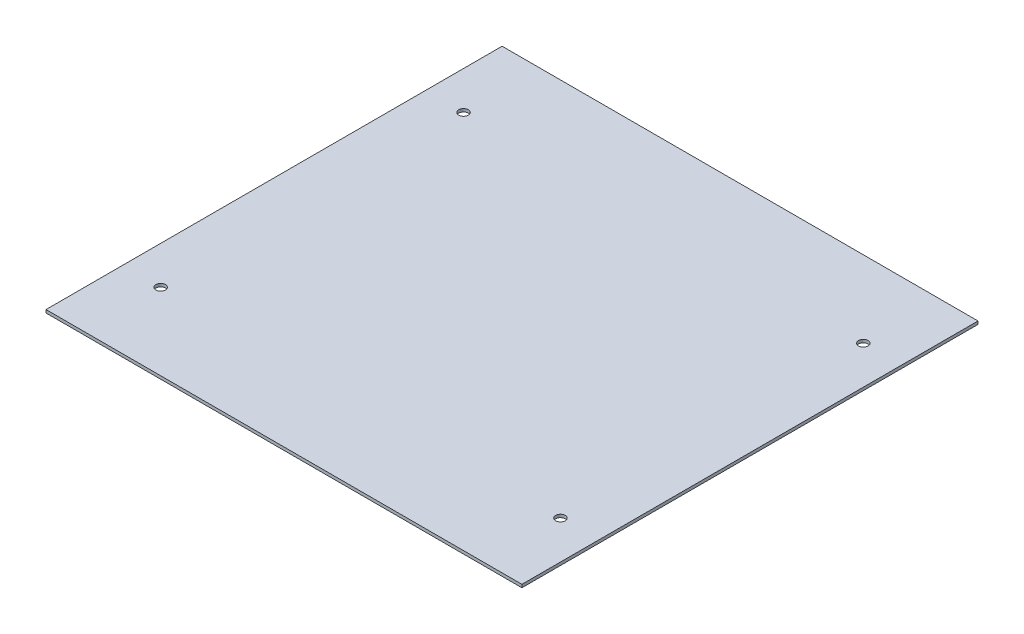
ISO-10303-21;
HEADER;
FILE_DESCRIPTION(('STEP AP214'),'2;1');
FILE_NAME('part.step','',(''),(''),'','','');
FILE_SCHEMA(('AUTOMOTIVE_DESIGN { 1 0 10303 214 1 1 1 1 }'));
ENDSEC;
DATA;
#1=APPLICATION_CONTEXT('core data for automotive mechanical design processes');
#2=APPLICATION_PROTOCOL_DEFINITION('international standard','automotive_design',2000,#1);
#3=PRODUCT_CONTEXT('',#1,'mechanical');
#4=PRODUCT('Part','Part','',(#3));
#5=PRODUCT_RELATED_PRODUCT_CATEGORY('part','',(#4));
#6=PRODUCT_DEFINITION_FORMATION('','',#4);
#7=PRODUCT_DEFINITION_CONTEXT('part definition',#1,'design');
#8=PRODUCT_DEFINITION('design','',#6,#7);
#9=PRODUCT_DEFINITION_SHAPE('','',#8);
#10=(LENGTH_UNIT() NAMED_UNIT(*) SI_UNIT(.MILLI.,.METRE.));
#11=(NAMED_UNIT(*) PLANE_ANGLE_UNIT() SI_UNIT($,.RADIAN.));
#12=(NAMED_UNIT(*) SI_UNIT($,.STERADIAN.) SOLID_ANGLE_UNIT());
#13=UNCERTAINTY_MEASURE_WITH_UNIT(LENGTH_MEASURE(1.E-05),#10,'distance_accuracy_value','');
#14=(GEOMETRIC_REPRESENTATION_CONTEXT(3) GLOBAL_UNCERTAINTY_ASSIGNED_CONTEXT((#13)) GLOBAL_UNIT_ASSIGNED_CONTEXT((#10,
#11,#12)) REPRESENTATION_CONTEXT('',''));
#15=CARTESIAN_POINT('',(0.,0.,0.));
#16=DIRECTION('',(0.,0.,1.));
#17=DIRECTION('',(1.,0.,0.));
#18=AXIS2_PLACEMENT_3D('',#15,#16,#17);
#19=CARTESIAN_POINT('',(250.,3.175,239.6));
#20=DIRECTION('',(-1.,0.,0.));
#21=DIRECTION('',(0.,0.,1.));
#22=AXIS2_PLACEMENT_3D('',#19,#20,#21);
#23=PLANE('',#22);
#24=DIRECTION('',(0.,0.,-1.));
#25=VECTOR('',#24,1.);
#26=CARTESIAN_POINT('',(250.,0.,239.6));
#27=LINE('',#26,#25);
#28=CARTESIAN_POINT('',(250.,0.,239.6));
#29=VERTEX_POINT('',#28);
#30=CARTESIAN_POINT('',(250.,0.,-239.6));
#31=VERTEX_POINT('',#30);
#32=EDGE_CURVE('E96',#29,#31,#27,.T.);
#33=ORIENTED_EDGE('',*,*,#32,.T.);
#34=DIRECTION('',(0.,-1.,0.));
#35=VECTOR('',#34,1.);
#36=CARTESIAN_POINT('',(250.,3.175,-239.6));
#37=LINE('',#36,#35);
#38=CARTESIAN_POINT('',(250.,3.175,-239.6));
#39=VERTEX_POINT('',#38);
#40=EDGE_CURVE('E11',#39,#31,#37,.T.);
#41=ORIENTED_EDGE('',*,*,#40,.F.);
#42=DIRECTION('',(0.,0.,-1.));
#43=VECTOR('',#42,1.);
#44=CARTESIAN_POINT('',(250.,3.175,239.6));
#45=LINE('',#44,#43);
#46=CARTESIAN_POINT('',(250.,3.175,239.6));
#47=VERTEX_POINT('',#46);
#48=EDGE_CURVE('E84',#47,#39,#45,.T.);
#49=ORIENTED_EDGE('',*,*,#48,.F.);
#50=DIRECTION('',(0.,-1.,0.));
#51=VECTOR('',#50,1.);
#52=CARTESIAN_POINT('',(250.,3.175,239.6));
#53=LINE('',#52,#51);
#54=EDGE_CURVE('E92',#47,#29,#53,.T.);
#55=ORIENTED_EDGE('',*,*,#54,.T.);
#56=EDGE_LOOP('',(#33,#41,#49,#55));
#57=FACE_BOUND('',#56,.T.);
#58=ADVANCED_FACE('F33',(#57),#23,.F.);
#59=CARTESIAN_POINT('',(-250.,3.175,-239.6));
#60=DIRECTION('',(0.,0.,1.));
#61=DIRECTION('',(1.,0.,0.));
#62=AXIS2_PLACEMENT_3D('',#59,#60,#61);
#63=PLANE('',#62);
#64=DIRECTION('',(-1.,0.,0.));
#65=VECTOR('',#64,1.);
#66=CARTESIAN_POINT('',(-250.,0.,-239.6));
#67=LINE('',#66,#65);
#68=CARTESIAN_POINT('',(-250.,0.,-239.6));
#69=VERTEX_POINT('',#68);
#70=EDGE_CURVE('E88',#31,#69,#67,.T.);
#71=ORIENTED_EDGE('',*,*,#70,.T.);
#72=DIRECTION('',(0.,-1.,0.));
#73=VECTOR('',#72,1.);
#74=CARTESIAN_POINT('',(-250.,3.175,-239.6));
#75=LINE('',#74,#73);
#76=CARTESIAN_POINT('',(-250.,3.175,-239.6));
#77=VERTEX_POINT('',#76);
#78=EDGE_CURVE('E41',#77,#69,#75,.T.);
#79=ORIENTED_EDGE('',*,*,#78,.F.);
#80=DIRECTION('',(-1.,0.,0.));
#81=VECTOR('',#80,1.);
#82=CARTESIAN_POINT('',(-250.,3.175,-239.6));
#83=LINE('',#82,#81);
#84=EDGE_CURVE('E79',#39,#77,#83,.T.);
#85=ORIENTED_EDGE('',*,*,#84,.F.);
#86=ORIENTED_EDGE('',*,*,#40,.T.);
#87=EDGE_LOOP('',(#71,#79,#85,#86));
#88=FACE_BOUND('',#87,.T.);
#89=ADVANCED_FACE('F87',(#88),#63,.F.);
#90=CARTESIAN_POINT('',(-250.,3.175,239.6));
#91=DIRECTION('',(1.,0.,0.));
#92=DIRECTION('',(0.,0.,-1.));
#93=AXIS2_PLACEMENT_3D('',#90,#91,#92);
#94=PLANE('',#93);
#95=DIRECTION('',(0.,0.,1.));
#96=VECTOR('',#95,1.);
#97=CARTESIAN_POINT('',(-250.,0.,239.6));
#98=LINE('',#97,#96);
#99=CARTESIAN_POINT('',(-250.,0.,239.6));
#100=VERTEX_POINT('',#99);
#101=EDGE_CURVE('E66',#69,#100,#98,.T.);
#102=ORIENTED_EDGE('',*,*,#101,.T.);
#103=DIRECTION('',(0.,-1.,0.));
#104=VECTOR('',#103,1.);
#105=CARTESIAN_POINT('',(-250.,3.175,239.6));
#106=LINE('',#105,#104);
#107=CARTESIAN_POINT('',(-250.,3.175,239.6));
#108=VERTEX_POINT('',#107);
#109=EDGE_CURVE('E89',#108,#100,#106,.T.);
#110=ORIENTED_EDGE('',*,*,#109,.F.);
#111=DIRECTION('',(0.,0.,1.));
#112=VECTOR('',#111,1.);
#113=CARTESIAN_POINT('',(-250.,3.175,239.6));
#114=LINE('',#113,#112);
#115=EDGE_CURVE('E82',#77,#108,#114,.T.);
#116=ORIENTED_EDGE('',*,*,#115,.F.);
#117=ORIENTED_EDGE('',*,*,#78,.T.);
#118=EDGE_LOOP('',(#102,#110,#116,#117));
#119=FACE_BOUND('',#118,.T.);
#120=ADVANCED_FACE('F90',(#119),#94,.F.);
#121=CARTESIAN_POINT('',(-250.,3.175,239.6));
#122=DIRECTION('',(0.,0.,-1.));
#123=DIRECTION('',(-1.,0.,0.));
#124=AXIS2_PLACEMENT_3D('',#121,#122,#123);
#125=PLANE('',#124);
#126=DIRECTION('',(1.,0.,0.));
#127=VECTOR('',#126,1.);
#128=CARTESIAN_POINT('',(-250.,0.,239.6));
#129=LINE('',#128,#127);
#130=EDGE_CURVE('E72',#100,#29,#129,.T.);
#131=ORIENTED_EDGE('',*,*,#130,.T.);
#132=ORIENTED_EDGE('',*,*,#54,.F.);
#133=DIRECTION('',(1.,0.,0.));
#134=VECTOR('',#133,1.);
#135=CARTESIAN_POINT('',(-250.,3.175,239.6));
#136=LINE('',#135,#134);
#137=EDGE_CURVE('E49',#108,#47,#136,.T.);
#138=ORIENTED_EDGE('',*,*,#137,.F.);
#139=ORIENTED_EDGE('',*,*,#109,.T.);
#140=EDGE_LOOP('',(#131,#132,#138,#139));
#141=FACE_BOUND('',#140,.T.);
#142=ADVANCED_FACE('F104',(#141),#125,.F.);
#143=CARTESIAN_POINT('',(0.,3.175,0.));
#144=DIRECTION('',(0.,-1.,0.));
#145=DIRECTION('',(0.,0.,-1.));
#146=AXIS2_PLACEMENT_3D('',#143,#144,#145);
#147=PLANE('',#146);
#148=CARTESIAN_POINT('',(210.,3.175,-159.1));
#149=DIRECTION('',(0.,1.,0.));
#150=DIRECTION('',(0.,0.,1.));
#151=AXIS2_PLACEMENT_3D('',#148,#149,#150);
#152=CIRCLE('',#151,5.00000000000002);
#153=CARTESIAN_POINT('',(210.,3.175,-154.1));
#154=VERTEX_POINT('',#153);
#155=EDGE_CURVE('E113',#154,#154,#152,.T.);
#156=ORIENTED_EDGE('',*,*,#155,.F.);
#157=EDGE_LOOP('',(#156));
#158=FACE_BOUND('',#157,.T.);
#159=CARTESIAN_POINT('',(-210.,3.175,159.1));
#160=DIRECTION('',(0.,1.,0.));
#161=DIRECTION('',(0.,0.,1.));
#162=AXIS2_PLACEMENT_3D('',#159,#160,#161);
#163=CIRCLE('',#162,5.00000000000002);
#164=CARTESIAN_POINT('',(-210.,3.175,164.1));
#165=VERTEX_POINT('',#164);
#166=EDGE_CURVE('E119',#165,#165,#163,.T.);
#167=ORIENTED_EDGE('',*,*,#166,.F.);
#168=EDGE_LOOP('',(#167));
#169=FACE_BOUND('',#168,.T.);
#170=CARTESIAN_POINT('',(210.,3.175,159.1));
#171=DIRECTION('',(0.,1.,0.));
#172=DIRECTION('',(0.,0.,1.));
#173=AXIS2_PLACEMENT_3D('',#170,#171,#172);
#174=CIRCLE('',#173,4.99999999999999);
#175=CARTESIAN_POINT('',(210.,3.175,164.1));
#176=VERTEX_POINT('',#175);
#177=EDGE_CURVE('E120',#176,#176,#174,.T.);
#178=ORIENTED_EDGE('',*,*,#177,.F.);
#179=EDGE_LOOP('',(#178));
#180=FACE_BOUND('',#179,.T.);
#181=CARTESIAN_POINT('',(-210.,3.175,-159.1));
#182=DIRECTION('',(0.,1.,0.));
#183=DIRECTION('',(0.,0.,1.));
#184=AXIS2_PLACEMENT_3D('',#181,#182,#183);
#185=CIRCLE('',#184,4.99999999999999);
#186=CARTESIAN_POINT('',(-210.,3.175,-154.1));
#187=VERTEX_POINT('',#186);
#188=EDGE_CURVE('E99',#187,#187,#185,.T.);
#189=ORIENTED_EDGE('',*,*,#188,.F.);
#190=EDGE_LOOP('',(#189));
#191=FACE_BOUND('',#190,.T.);
#192=ORIENTED_EDGE('',*,*,#48,.T.);
#193=ORIENTED_EDGE('',*,*,#84,.T.);
#194=ORIENTED_EDGE('',*,*,#115,.T.);
#195=ORIENTED_EDGE('',*,*,#137,.T.);
#196=EDGE_LOOP('',(#192,#193,#194,#195));
#197=FACE_BOUND('',#196,.T.);
#198=ADVANCED_FACE('F80',(#158,#169,#180,#191,#197),#147,.F.);
#199=CARTESIAN_POINT('',(0.,0.,0.));
#200=DIRECTION('',(0.,-1.,0.));
#201=DIRECTION('',(0.,0.,-1.));
#202=AXIS2_PLACEMENT_3D('',#199,#200,#201);
#203=PLANE('',#202);
#204=CARTESIAN_POINT('',(210.,0.,-159.1));
#205=DIRECTION('',(0.,-1.,0.));
#206=DIRECTION('',(0.,0.,-1.));
#207=AXIS2_PLACEMENT_3D('',#204,#205,#206);
#208=CIRCLE('',#207,5.00000000000002);
#209=CARTESIAN_POINT('',(210.,0.,-164.1));
#210=VERTEX_POINT('',#209);
#211=EDGE_CURVE('E123',#210,#210,#208,.F.);
#212=ORIENTED_EDGE('',*,*,#211,.T.);
#213=EDGE_LOOP('',(#212));
#214=FACE_BOUND('',#213,.T.);
#215=CARTESIAN_POINT('',(-210.,0.,159.1));
#216=DIRECTION('',(0.,-1.,0.));
#217=DIRECTION('',(0.,0.,-1.));
#218=AXIS2_PLACEMENT_3D('',#215,#216,#217);
#219=CIRCLE('',#218,5.00000000000002);
#220=CARTESIAN_POINT('',(-210.,0.,154.1));
#221=VERTEX_POINT('',#220);
#222=EDGE_CURVE('E116',#221,#221,#219,.F.);
#223=ORIENTED_EDGE('',*,*,#222,.T.);
#224=EDGE_LOOP('',(#223));
#225=FACE_BOUND('',#224,.T.);
#226=CARTESIAN_POINT('',(210.,0.,159.1));
#227=DIRECTION('',(0.,-1.,0.));
#228=DIRECTION('',(0.,0.,-1.));
#229=AXIS2_PLACEMENT_3D('',#226,#227,#228);
#230=CIRCLE('',#229,4.99999999999999);
#231=CARTESIAN_POINT('',(210.,0.,154.1));
#232=VERTEX_POINT('',#231);
#233=EDGE_CURVE('E128',#232,#232,#230,.F.);
#234=ORIENTED_EDGE('',*,*,#233,.T.);
#235=EDGE_LOOP('',(#234));
#236=FACE_BOUND('',#235,.T.);
#237=CARTESIAN_POINT('',(-210.,0.,-159.1));
#238=DIRECTION('',(0.,-1.,0.));
#239=DIRECTION('',(0.,0.,-1.));
#240=AXIS2_PLACEMENT_3D('',#237,#238,#239);
#241=CIRCLE('',#240,4.99999999999999);
#242=CARTESIAN_POINT('',(-210.,0.,-164.1));
#243=VERTEX_POINT('',#242);
#244=EDGE_CURVE('E110',#243,#243,#241,.F.);
#245=ORIENTED_EDGE('',*,*,#244,.T.);
#246=EDGE_LOOP('',(#245));
#247=FACE_BOUND('',#246,.T.);
#248=ORIENTED_EDGE('',*,*,#32,.F.);
#249=ORIENTED_EDGE('',*,*,#130,.F.);
#250=ORIENTED_EDGE('',*,*,#101,.F.);
#251=ORIENTED_EDGE('',*,*,#70,.F.);
#252=EDGE_LOOP('',(#248,#249,#250,#251));
#253=FACE_BOUND('',#252,.T.);
#254=ADVANCED_FACE('F107',(#214,#225,#236,#247,#253),#203,.T.);
#255=CARTESIAN_POINT('',(-210.,-0.00100000000000013,-159.1));
#256=DIRECTION('',(0.,1.,0.));
#257=DIRECTION('',(0.,0.,1.));
#258=AXIS2_PLACEMENT_3D('',#255,#256,#257);
#259=CYLINDRICAL_SURFACE('',#258,4.99999999999999);
#260=ORIENTED_EDGE('',*,*,#244,.F.);
#261=EDGE_LOOP('',(#260));
#262=FACE_BOUND('',#261,.T.);
#263=ORIENTED_EDGE('',*,*,#188,.T.);
#264=EDGE_LOOP('',(#263));
#265=FACE_BOUND('',#264,.T.);
#266=ADVANCED_FACE('F142',(#262,#265),#259,.F.);
#267=CARTESIAN_POINT('',(210.,-0.00100000000000013,159.1));
#268=DIRECTION('',(0.,1.,0.));
#269=DIRECTION('',(0.,0.,1.));
#270=AXIS2_PLACEMENT_3D('',#267,#268,#269);
#271=CYLINDRICAL_SURFACE('',#270,4.99999999999999);
#272=ORIENTED_EDGE('',*,*,#233,.F.);
#273=EDGE_LOOP('',(#272));
#274=FACE_BOUND('',#273,.T.);
#275=ORIENTED_EDGE('',*,*,#177,.T.);
#276=EDGE_LOOP('',(#275));
#277=FACE_BOUND('',#276,.T.);
#278=ADVANCED_FACE('F134',(#274,#277),#271,.F.);
#279=CARTESIAN_POINT('',(-210.,-0.00100000000000013,159.1));
#280=DIRECTION('',(0.,1.,0.));
#281=DIRECTION('',(0.,0.,1.));
#282=AXIS2_PLACEMENT_3D('',#279,#280,#281);
#283=CYLINDRICAL_SURFACE('',#282,5.00000000000002);
#284=ORIENTED_EDGE('',*,*,#222,.F.);
#285=EDGE_LOOP('',(#284));
#286=FACE_BOUND('',#285,.T.);
#287=ORIENTED_EDGE('',*,*,#166,.T.);
#288=EDGE_LOOP('',(#287));
#289=FACE_BOUND('',#288,.T.);
#290=ADVANCED_FACE('F150',(#286,#289),#283,.F.);
#291=CARTESIAN_POINT('',(210.,-0.00100000000000013,-159.1));
#292=DIRECTION('',(0.,1.,0.));
#293=DIRECTION('',(0.,0.,1.));
#294=AXIS2_PLACEMENT_3D('',#291,#292,#293);
#295=CYLINDRICAL_SURFACE('',#294,5.00000000000002);
#296=ORIENTED_EDGE('',*,*,#211,.F.);
#297=EDGE_LOOP('',(#296));
#298=FACE_BOUND('',#297,.T.);
#299=ORIENTED_EDGE('',*,*,#155,.T.);
#300=EDGE_LOOP('',(#299));
#301=FACE_BOUND('',#300,.T.);
#302=ADVANCED_FACE('F198',(#298,#301),#295,.F.);
#303=CLOSED_SHELL('',(#58,#89,#120,#142,#198,#254,#266,#278,#290,#302));
#304=MANIFOLD_SOLID_BREP('B2',#303);
#305=ADVANCED_BREP_SHAPE_REPRESENTATION('',(#18,#304),#14);
#306=SHAPE_DEFINITION_REPRESENTATION(#9,#305);
ENDSEC;
END-ISO-10303-21;
